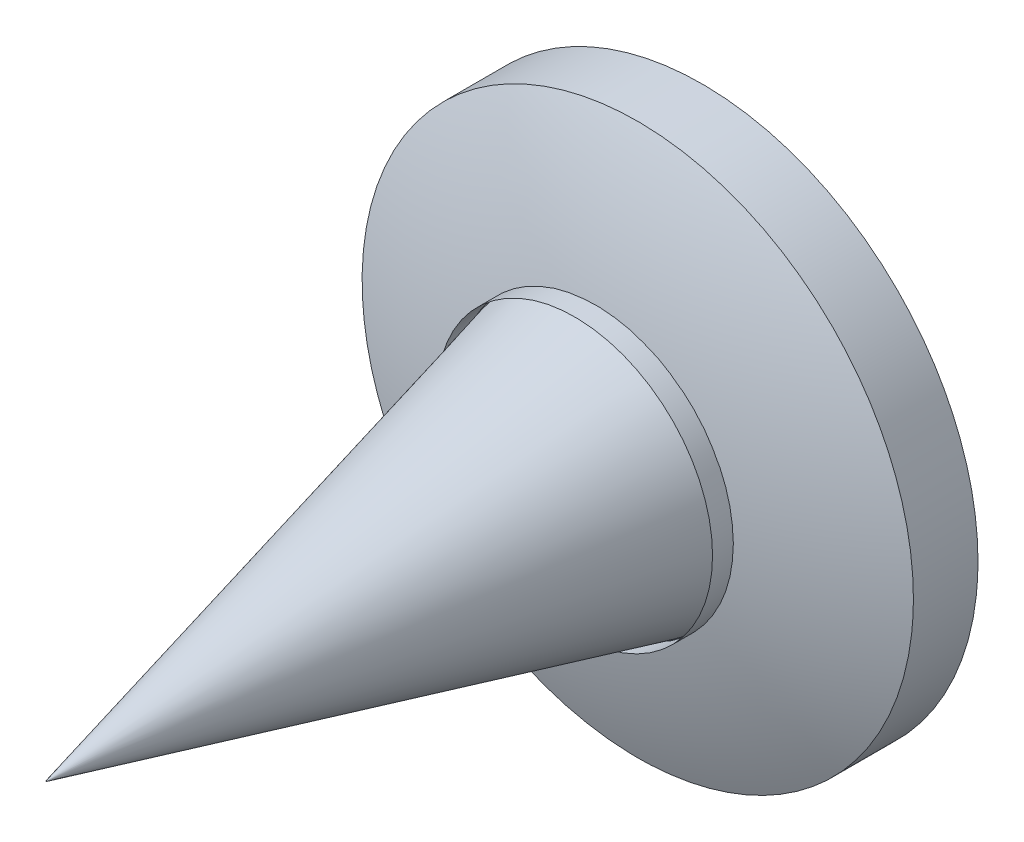
ISO-10303-21;
HEADER;
FILE_DESCRIPTION(('STEP AP214'),'2;1');
FILE_NAME('part.step','',(''),(''),'','','');
FILE_SCHEMA(('AUTOMOTIVE_DESIGN { 1 0 10303 214 1 1 1 1 }'));
ENDSEC;
DATA;
#1=APPLICATION_CONTEXT('core data for automotive mechanical design processes');
#2=APPLICATION_PROTOCOL_DEFINITION('international standard','automotive_design',2000,#1);
#3=PRODUCT_CONTEXT('',#1,'mechanical');
#4=PRODUCT('Part','Part','',(#3));
#5=PRODUCT_RELATED_PRODUCT_CATEGORY('part','',(#4));
#6=PRODUCT_DEFINITION_FORMATION('','',#4);
#7=PRODUCT_DEFINITION_CONTEXT('part definition',#1,'design');
#8=PRODUCT_DEFINITION('design','',#6,#7);
#9=PRODUCT_DEFINITION_SHAPE('','',#8);
#10=(LENGTH_UNIT() NAMED_UNIT(*) SI_UNIT(.MILLI.,.METRE.));
#11=(NAMED_UNIT(*) PLANE_ANGLE_UNIT() SI_UNIT($,.RADIAN.));
#12=(NAMED_UNIT(*) SI_UNIT($,.STERADIAN.) SOLID_ANGLE_UNIT());
#13=UNCERTAINTY_MEASURE_WITH_UNIT(LENGTH_MEASURE(1.E-05),#10,'distance_accuracy_value','');
#14=(GEOMETRIC_REPRESENTATION_CONTEXT(3) GLOBAL_UNCERTAINTY_ASSIGNED_CONTEXT((#13)) GLOBAL_UNIT_ASSIGNED_CONTEXT((#10,
#11,#12)) REPRESENTATION_CONTEXT('',''));
#15=CARTESIAN_POINT('',(0.,0.,0.));
#16=DIRECTION('',(0.,0.,1.));
#17=DIRECTION('',(1.,0.,0.));
#18=AXIS2_PLACEMENT_3D('',#15,#16,#17);
#19=CARTESIAN_POINT('',(0.,0.,3.5));
#20=DIRECTION('',(0.,0.,-1.));
#21=DIRECTION('',(1.,0.,0.));
#22=AXIS2_PLACEMENT_3D('',#19,#20,#21);
#23=CONICAL_SURFACE('',#22,3.,0.244346095279207);
#24=CARTESIAN_POINT('',(0.,0.,3.5));
#25=DIRECTION('',(0.,0.,1.));
#26=DIRECTION('',(1.,0.,0.));
#27=AXIS2_PLACEMENT_3D('',#24,#25,#26);
#28=CIRCLE('',#27,3.);
#29=CARTESIAN_POINT('',(3.,0.,3.5));
#30=VERTEX_POINT('',#29);
#31=EDGE_CURVE('P0_E49',#30,#30,#28,.T.);
#32=CARTESIAN_POINT('',(0.,0.,15.5));
#33=DIRECTION('',(0.,0.,1.));
#34=DIRECTION('',(1.,0.,0.));
#35=AXIS2_PLACEMENT_3D('',#32,#33,#34);
#36=CIRCLE('',#35,0.00806396588182586);
#37=CARTESIAN_POINT('',(0.00806396588182547,0.,15.5));
#38=VERTEX_POINT('',#37);
#39=EDGE_CURVE('P0_E11',#38,#38,#36,.T.);
#40=CARTESIAN_POINT('',(3.,0.,3.5));
#41=CARTESIAN_POINT('',(2.9688339996446,0.,3.625));
#42=CARTESIAN_POINT('',(2.93766799928921,0.,3.75));
#43=CARTESIAN_POINT('',(2.87533599857841,0.,4.));
#44=CARTESIAN_POINT('',(2.84416999822301,0.,4.125));
#45=CARTESIAN_POINT('',(2.78183799751222,0.,4.375));
#46=CARTESIAN_POINT('',(2.75067199715682,0.,4.5));
#47=CARTESIAN_POINT('',(2.68833999644602,0.,4.75));
#48=CARTESIAN_POINT('',(2.65717399609063,0.,4.875));
#49=CARTESIAN_POINT('',(2.59484199537983,0.,5.125));
#50=CARTESIAN_POINT('',(2.56367599502443,0.,5.25));
#51=CARTESIAN_POINT('',(2.50134399431364,0.,5.5));
#52=CARTESIAN_POINT('',(2.47017799395824,0.,5.625));
#53=CARTESIAN_POINT('',(2.40784599324745,0.,5.875));
#54=CARTESIAN_POINT('',(2.37667999289205,0.,6.));
#55=CARTESIAN_POINT('',(2.31434799218125,0.,6.25));
#56=CARTESIAN_POINT('',(2.28318199182585,0.,6.375));
#57=CARTESIAN_POINT('',(2.22084999111506,0.,6.625));
#58=CARTESIAN_POINT('',(2.18968399075966,0.,6.75));
#59=CARTESIAN_POINT('',(2.12735199004887,0.,7.));
#60=CARTESIAN_POINT('',(2.09618598969347,0.,7.125));
#61=CARTESIAN_POINT('',(2.03385398898267,0.,7.375));
#62=CARTESIAN_POINT('',(2.00268798862728,0.,7.5));
#63=CARTESIAN_POINT('',(1.94035598791648,0.,7.75));
#64=CARTESIAN_POINT('',(1.90918998756108,0.,7.875));
#65=CARTESIAN_POINT('',(1.84685798685029,0.,8.125));
#66=CARTESIAN_POINT('',(1.81569198649489,0.,8.25));
#67=CARTESIAN_POINT('',(1.75335998578409,0.,8.5));
#68=CARTESIAN_POINT('',(1.7221939854287,0.,8.625));
#69=CARTESIAN_POINT('',(1.6598619847179,0.,8.875));
#70=CARTESIAN_POINT('',(1.6286959843625,0.,9.));
#71=CARTESIAN_POINT('',(1.56636398365171,0.,9.25));
#72=CARTESIAN_POINT('',(1.53519798329631,0.,9.375));
#73=CARTESIAN_POINT('',(1.47286598258552,0.,9.625));
#74=CARTESIAN_POINT('',(1.44169998223012,0.,9.75));
#75=CARTESIAN_POINT('',(1.37936798151932,0.,10.));
#76=CARTESIAN_POINT('',(1.34820198116392,0.,10.125));
#77=CARTESIAN_POINT('',(1.28586998045313,0.,10.375));
#78=CARTESIAN_POINT('',(1.25470398009773,0.,10.5));
#79=CARTESIAN_POINT('',(1.19237197938694,0.,10.75));
#80=CARTESIAN_POINT('',(1.16120597903154,0.,10.875));
#81=CARTESIAN_POINT('',(1.09887397832074,0.,11.125));
#82=CARTESIAN_POINT('',(1.06770797796535,0.,11.25));
#83=CARTESIAN_POINT('',(1.00537597725455,0.,11.5));
#84=CARTESIAN_POINT('',(0.974209976899153,0.,11.625));
#85=CARTESIAN_POINT('',(0.911877976188358,0.,11.875));
#86=CARTESIAN_POINT('',(0.88071197583296,0.,12.));
#87=CARTESIAN_POINT('',(0.818379975122164,0.,12.25));
#88=CARTESIAN_POINT('',(0.787213974766767,0.,12.375));
#89=CARTESIAN_POINT('',(0.724881974055971,0.,12.625));
#90=CARTESIAN_POINT('',(0.693715973700574,0.,12.75));
#91=CARTESIAN_POINT('',(0.631383972989779,0.,13.));
#92=CARTESIAN_POINT('',(0.600217972634381,0.,13.125));
#93=CARTESIAN_POINT('',(0.537885971923586,0.,13.375));
#94=CARTESIAN_POINT('',(0.506719971568188,0.,13.5));
#95=CARTESIAN_POINT('',(0.444387970857393,0.,13.75));
#96=CARTESIAN_POINT('',(0.413221970501995,0.,13.875));
#97=CARTESIAN_POINT('',(0.3508899697912,0.,14.125));
#98=CARTESIAN_POINT('',(0.319723969435802,0.,14.25));
#99=CARTESIAN_POINT('',(0.257391968725007,0.,14.5));
#100=CARTESIAN_POINT('',(0.226225968369609,0.,14.625));
#101=CARTESIAN_POINT('',(0.163893967658814,0.,14.875));
#102=CARTESIAN_POINT('',(0.132727967303416,0.,15.));
#103=CARTESIAN_POINT('',(0.0703959665926209,0.,15.25));
#104=CARTESIAN_POINT('',(0.0392299662372231,0.,15.375));
#105=CARTESIAN_POINT('',(0.00806396588182547,0.,15.5));
#106=B_SPLINE_CURVE_WITH_KNOTS('',3,(#40,#41,#42,#43,#44,#45,#46,#47,#48,#49,#50,#51,#52,#53,
#54,#55,#56,#57,#58,#59,#60,#61,#62,#63,#64,#65,#66,#67,#68,#69,#70,#71,#72,#73,#74,#75,#76,#77,
#78,#79,#80,#81,#82,#83,#84,#85,#86,#87,#88,#89,#90,#91,#92,#93,#94,#95,#96,#97,#98,#99,#100,
#101,#102,#103,#104,#105),.UNSPECIFIED.,.F.,.F.,(4,2,2,2,2,2,2,2,2,2,2,2,2,2,2,2,2,2,2,2,2,2,2,
2,2,2,2,2,2,2,2,2,4),(0.,0.386480111006212,0.772960222012424,1.15944033301864,1.54592044402485,
1.93240055503106,2.31888066603727,2.70536077704348,3.0918408880497,3.47832099905591,
3.86480111006212,4.25128122106833,4.63776133207454,5.02424144308075,5.41072155408697,
5.79720166509318,6.18368177609939,6.5701618871056,6.95664199811181,7.34312210911802,
7.72960222012423,8.11608233113045,8.50256244213666,8.88904255314287,9.27552266414908,
9.6620027751553,10.0484828861615,10.4349629971677,10.8214431081739,11.2079232191801,
11.5944033301864,11.9808834411926,12.3673635521988),.UNSPECIFIED.);
#107=EDGE_CURVE('P0_BSEAM45',#30,#38,#106,.T.);
#108=ORIENTED_EDGE('',*,*,#31,.T.);
#109=ORIENTED_EDGE('',*,*,#39,.F.);
#110=ORIENTED_EDGE('',*,*,#107,.T.);
#111=ORIENTED_EDGE('',*,*,#107,.F.);
#112=EDGE_LOOP('',(#108,#110,#109,#111));
#113=FACE_BOUND('',#112,.T.);
#114=ADVANCED_FACE('P0_F45',(#113),#23,.T.);
#115=OPEN_SHELL('',(#114));
#116=SHELL_BASED_SURFACE_MODEL('P0_B2',(#115));
#117=CARTESIAN_POINT('',(0.,0.,0.));
#118=DIRECTION('',(0.,0.,1.));
#119=DIRECTION('',(1.,0.,0.));
#120=AXIS2_PLACEMENT_3D('',#117,#118,#119);
#121=CYLINDRICAL_SURFACE('',#120,3.);
#122=CARTESIAN_POINT('',(0.,0.,0.));
#123=DIRECTION('',(0.,0.,1.));
#124=DIRECTION('',(1.,0.,0.));
#125=AXIS2_PLACEMENT_3D('',#122,#123,#124);
#126=CIRCLE('',#125,3.);
#127=CARTESIAN_POINT('',(3.,0.,0.));
#128=VERTEX_POINT('',#127);
#129=EDGE_CURVE('P0_E72',#128,#128,#126,.T.);
#130=ORIENTED_EDGE('',*,*,#129,.T.);
#131=EDGE_LOOP('',(#130));
#132=FACE_BOUND('',#131,.T.);
#133=CARTESIAN_POINT('',(0.,0.,4.));
#134=DIRECTION('',(0.,0.,1.));
#135=DIRECTION('',(1.,0.,0.));
#136=AXIS2_PLACEMENT_3D('',#133,#134,#135);
#137=CIRCLE('',#136,3.);
#138=CARTESIAN_POINT('',(3.,0.,4.));
#139=VERTEX_POINT('',#138);
#140=EDGE_CURVE('P0_E44',#139,#139,#137,.T.);
#141=ORIENTED_EDGE('',*,*,#140,.F.);
#142=EDGE_LOOP('',(#141));
#143=FACE_BOUND('',#142,.T.);
#144=ADVANCED_FACE('P0_F68',(#132,#143),#121,.T.);
#145=OPEN_SHELL('',(#144));
#146=SHELL_BASED_SURFACE_MODEL('P0_B6',(#145));
#147=CARTESIAN_POINT('',(0.,0.,1.2220823065156));
#148=DIRECTION('',(0.,0.,1.));
#149=DIRECTION('',(1.,0.,0.));
#150=AXIS2_PLACEMENT_3D('',#147,#148,#149);
#151=CYLINDRICAL_SURFACE('',#150,6.);
#152=CARTESIAN_POINT('',(6.,0.,2.6279176934844));
#153=CARTESIAN_POINT('',(6.,6.,2.6279176934844));
#154=CARTESIAN_POINT('',(0.,6.,2.6279176934844));
#155=CARTESIAN_POINT('',(-6.,6.,2.6279176934844));
#156=CARTESIAN_POINT('',(-6.,0.,2.6279176934844));
#157=CARTESIAN_POINT('',(-6.,-6.,2.6279176934844));
#158=CARTESIAN_POINT('',(0.,-6.,2.6279176934844));
#159=CARTESIAN_POINT('',(6.,-6.,2.6279176934844));
#160=CARTESIAN_POINT('',(6.,0.,2.6279176934844));
#161=(BOUNDED_CURVE() B_SPLINE_CURVE(2,(#152,#153,#154,#155,#156,#157,#158,#159,#160),
.UNSPECIFIED.,.T.,.F.) B_SPLINE_CURVE_WITH_KNOTS((3,2,2,2,3),(0.,1.5707963267949,
3.14159265358979,4.71238898038469,6.28318530717959),
.UNSPECIFIED.) CURVE() GEOMETRIC_REPRESENTATION_ITEM() RATIONAL_B_SPLINE_CURVE((1.,
0.707106781186548,1.,0.707106781186548,1.,0.707106781186548,1.,0.707106781186548,1.)) REPRESENTATION_ITEM(''));
#162=CARTESIAN_POINT('',(6.,0.,2.6279176934844));
#163=VERTEX_POINT('',#162);
#164=EDGE_CURVE('P1_E27',#163,#163,#161,.T.);
#165=ORIENTED_EDGE('',*,*,#164,.F.);
#166=CARTESIAN_POINT('',(6.,0.,1.2220823065156));
#167=CARTESIAN_POINT('',(6.,0.,2.6279176934844));
#168=(BOUNDED_CURVE() B_SPLINE_CURVE(1,(#166,#167),.UNSPECIFIED.,.F.,
.F.) B_SPLINE_CURVE_WITH_KNOTS((2,2),(0.,1.),
.UNSPECIFIED.) CURVE() GEOMETRIC_REPRESENTATION_ITEM() RATIONAL_B_SPLINE_CURVE((1.,1.)) REPRESENTATION_ITEM(''));
#169=CARTESIAN_POINT('',(6.,0.,1.2220823065156));
#170=VERTEX_POINT('',#169);
#171=EDGE_CURVE('P1_E11',#170,#163,#168,.T.);
#172=ORIENTED_EDGE('',*,*,#171,.F.);
#173=CARTESIAN_POINT('',(6.,0.,1.2220823065156));
#174=CARTESIAN_POINT('',(6.,6.,1.2220823065156));
#175=CARTESIAN_POINT('',(0.,6.,1.2220823065156));
#176=CARTESIAN_POINT('',(-6.,6.,1.2220823065156));
#177=CARTESIAN_POINT('',(-6.,0.,1.2220823065156));
#178=CARTESIAN_POINT('',(-6.,-6.,1.2220823065156));
#179=CARTESIAN_POINT('',(0.,-6.,1.2220823065156));
#180=CARTESIAN_POINT('',(6.,-6.,1.2220823065156));
#181=CARTESIAN_POINT('',(6.,0.,1.2220823065156));
#182=(BOUNDED_CURVE() B_SPLINE_CURVE(2,(#173,#174,#175,#176,#177,#178,#179,#180,#181),
.UNSPECIFIED.,.T.,.F.) B_SPLINE_CURVE_WITH_KNOTS((3,2,2,2,3),(0.,1.5707963267949,
3.14159265358979,4.71238898038469,6.28318530717959),
.UNSPECIFIED.) CURVE() GEOMETRIC_REPRESENTATION_ITEM() RATIONAL_B_SPLINE_CURVE((1.,
0.707106781186548,1.,0.707106781186548,1.,0.707106781186548,1.,0.707106781186548,1.)) REPRESENTATION_ITEM(''));
#183=EDGE_CURVE('P1_E42',#170,#170,#182,.T.);
#184=ORIENTED_EDGE('',*,*,#183,.T.);
#185=ORIENTED_EDGE('',*,*,#171,.T.);
#186=EDGE_LOOP('',(#165,#172,#184,#185));
#187=FACE_BOUND('',#186,.T.);
#188=ADVANCED_FACE('P1_F17',(#187),#151,.T.);
#189=CARTESIAN_POINT('',(0.,0.,-11.49));
#190=DIRECTION('',(-1.,0.,0.));
#191=DIRECTION('',(0.,-1.,0.));
#192=AXIS2_PLACEMENT_3D('',#189,#190,#191);
#193=SPHERICAL_SURFACE('',#192,15.34);
#194=ORIENTED_EDGE('',*,*,#164,.T.);
#195=EDGE_LOOP('',(#194));
#196=FACE_BOUND('',#195,.T.);
#197=ADVANCED_FACE('P1_F68',(#196),#193,.T.);
#198=CARTESIAN_POINT('',(0.,0.,15.34));
#199=DIRECTION('',(1.,0.,0.));
#200=DIRECTION('',(0.,-1.,0.));
#201=AXIS2_PLACEMENT_3D('',#198,#199,#200);
#202=SPHERICAL_SURFACE('',#201,15.34);
#203=ORIENTED_EDGE('',*,*,#183,.F.);
#204=EDGE_LOOP('',(#203));
#205=FACE_BOUND('',#204,.T.);
#206=ADVANCED_FACE('P1_F63',(#205),#202,.T.);
#207=CLOSED_SHELL('',(#188,#197,#206));
#208=MANIFOLD_SOLID_BREP('P1_B1',#207);
#209=ADVANCED_BREP_SHAPE_REPRESENTATION('',(#18,#208),#14);
#210=MANIFOLD_SURFACE_SHAPE_REPRESENTATION('',(#18,#116,#146),#14);
#211=SHAPE_REPRESENTATION('',(#18),#14);
#212=SHAPE_DEFINITION_REPRESENTATION(#9,#211);
#213=SHAPE_REPRESENTATION_RELATIONSHIP('','',#211,#209);
#214=SHAPE_REPRESENTATION_RELATIONSHIP('','',#211,#210);
ENDSEC;
END-ISO-10303-21;
